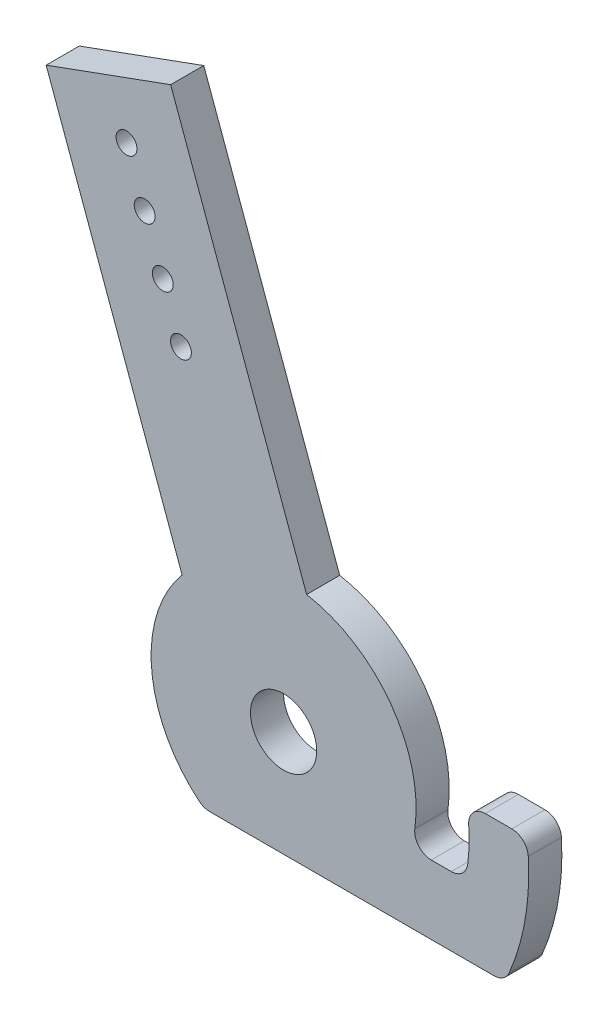
ISO-10303-21;
HEADER;
FILE_DESCRIPTION(('STEP AP214'),'2;1');
FILE_NAME('part.step','',(''),(''),'','','');
FILE_SCHEMA(('AUTOMOTIVE_DESIGN { 1 0 10303 214 1 1 1 1 }'));
ENDSEC;
DATA;
#1=APPLICATION_CONTEXT('core data for automotive mechanical design processes');
#2=APPLICATION_PROTOCOL_DEFINITION('international standard','automotive_design',2000,#1);
#3=PRODUCT_CONTEXT('',#1,'mechanical');
#4=PRODUCT('Part','Part','',(#3));
#5=PRODUCT_RELATED_PRODUCT_CATEGORY('part','',(#4));
#6=PRODUCT_DEFINITION_FORMATION('','',#4);
#7=PRODUCT_DEFINITION_CONTEXT('part definition',#1,'design');
#8=PRODUCT_DEFINITION('design','',#6,#7);
#9=PRODUCT_DEFINITION_SHAPE('','',#8);
#10=(LENGTH_UNIT() NAMED_UNIT(*) SI_UNIT(.MILLI.,.METRE.));
#11=(NAMED_UNIT(*) PLANE_ANGLE_UNIT() SI_UNIT($,.RADIAN.));
#12=(NAMED_UNIT(*) SI_UNIT($,.STERADIAN.) SOLID_ANGLE_UNIT());
#13=UNCERTAINTY_MEASURE_WITH_UNIT(LENGTH_MEASURE(1.E-05),#10,'distance_accuracy_value','');
#14=(GEOMETRIC_REPRESENTATION_CONTEXT(3) GLOBAL_UNCERTAINTY_ASSIGNED_CONTEXT((#13)) GLOBAL_UNIT_ASSIGNED_CONTEXT((#10,
#11,#12)) REPRESENTATION_CONTEXT('',''));
#15=CARTESIAN_POINT('',(0.,0.,0.));
#16=DIRECTION('',(0.,0.,1.));
#17=DIRECTION('',(1.,0.,0.));
#18=AXIS2_PLACEMENT_3D('',#15,#16,#17);
#19=CARTESIAN_POINT('',(0.,0.,1.5875));
#20=DIRECTION('',(0.,0.,1.));
#21=DIRECTION('',(1.,0.,0.));
#22=AXIS2_PLACEMENT_3D('',#19,#20,#21);
#23=PLANE('',#22);
#24=CARTESIAN_POINT('',(-5.79014838102271,15.9083019321514,1.5875));
#25=DIRECTION('',(0.,0.,1.));
#26=DIRECTION('',(1.,0.,0.));
#27=AXIS2_PLACEMENT_3D('',#24,#25,#26);
#28=CIRCLE('',#27,0.500000000000001);
#29=CARTESIAN_POINT('',(-5.29014838102271,15.9083019321514,1.5875));
#30=VERTEX_POINT('',#29);
#31=EDGE_CURVE('E404',#30,#30,#28,.T.);
#32=ORIENTED_EDGE('',*,*,#31,.F.);
#33=EDGE_LOOP('',(#32));
#34=FACE_BOUND('',#33,.T.);
#35=CARTESIAN_POINT('',(-7.52761070911713,20.6819404457438,1.5875));
#36=DIRECTION('',(0.,0.,1.));
#37=DIRECTION('',(1.,0.,0.));
#38=AXIS2_PLACEMENT_3D('',#35,#36,#37);
#39=CIRCLE('',#38,0.500000000000001);
#40=CARTESIAN_POINT('',(-7.02761070911713,20.6819404457438,1.5875));
#41=VERTEX_POINT('',#40);
#42=EDGE_CURVE('E420',#41,#41,#39,.T.);
#43=ORIENTED_EDGE('',*,*,#42,.F.);
#44=EDGE_LOOP('',(#43));
#45=FACE_BOUND('',#44,.T.);
#46=CARTESIAN_POINT('',(0.,0.,1.5875));
#47=DIRECTION('',(0.,0.,1.));
#48=DIRECTION('',(1.,0.,0.));
#49=AXIS2_PLACEMENT_3D('',#46,#47,#48);
#50=CIRCLE('',#49,6.35);
#51=CARTESIAN_POINT('',(6.28944110649737,-0.874888888888844,1.5875));
#52=VERTEX_POINT('',#51);
#53=CARTESIAN_POINT('',(1.10266592818498,6.25352923162753,1.5875));
#54=VERTEX_POINT('',#53);
#55=EDGE_CURVE('E239',#52,#54,#50,.T.);
#56=ORIENTED_EDGE('',*,*,#55,.T.);
#57=DIRECTION('',(-0.342020143325673,0.939692620785907,0.));
#58=VECTOR('',#57,1.);
#59=CARTESIAN_POINT('',(1.10266592818498,6.25352923162753,1.5875));
#60=LINE('',#59,#58);
#61=CARTESIAN_POINT('',(-5.41281780216909,24.1546736575991,1.5875));
#62=VERTEX_POINT('',#61);
#63=EDGE_CURVE('E127',#54,#62,#60,.T.);
#64=ORIENTED_EDGE('',*,*,#63,.T.);
#65=DIRECTION('',(-0.939692620785907,-0.342020143325673,0.));
#66=VECTOR('',#65,1.);
#67=CARTESIAN_POINT('',(-11.3798659441596,21.982845747481,1.5875));
#68=LINE('',#67,#66);
#69=CARTESIAN_POINT('',(-11.3798659441596,21.982845747481,1.5875));
#70=VERTEX_POINT('',#69);
#71=EDGE_CURVE('E292',#62,#70,#68,.T.);
#72=ORIENTED_EDGE('',*,*,#71,.T.);
#73=DIRECTION('',(0.342020143325673,-0.939692620785907,0.));
#74=VECTOR('',#73,1.);
#75=CARTESIAN_POINT('',(-4.86438221380553,4.0817013215095,1.5875));
#76=LINE('',#75,#74);
#77=CARTESIAN_POINT('',(-4.86438221380553,4.0817013215095,1.5875));
#78=VERTEX_POINT('',#77);
#79=EDGE_CURVE('E312',#70,#78,#76,.T.);
#80=ORIENTED_EDGE('',*,*,#79,.T.);
#81=CARTESIAN_POINT('',(0.,0.,1.5875));
#82=DIRECTION('',(0.,0.,1.));
#83=DIRECTION('',(1.,0.,0.));
#84=AXIS2_PLACEMENT_3D('',#81,#82,#83);
#85=CIRCLE('',#84,6.35);
#86=CARTESIAN_POINT('',(-4.04060613759661,-4.89857142857146,1.5875));
#87=VERTEX_POINT('',#86);
#88=EDGE_CURVE('E308',#78,#87,#85,.T.);
#89=ORIENTED_EDGE('',*,*,#88,.T.);
#90=CARTESIAN_POINT('',(-3.53553037039703,-4.28625000000003,1.5875));
#91=DIRECTION('',(0.,0.,1.));
#92=DIRECTION('',(-1.,0.,0.));
#93=AXIS2_PLACEMENT_3D('',#90,#91,#92);
#94=CIRCLE('',#93,0.793749999999999);
#95=CARTESIAN_POINT('',(-3.53553037039703,-5.08000000000003,1.5875));
#96=VERTEX_POINT('',#95);
#97=EDGE_CURVE('E311',#87,#96,#94,.T.);
#98=ORIENTED_EDGE('',*,*,#97,.T.);
#99=DIRECTION('',(1.,0.,0.));
#100=VECTOR('',#99,1.);
#101=CARTESIAN_POINT('',(10.0803124951561,-5.07999999999993,1.5875));
#102=LINE('',#101,#100);
#103=CARTESIAN_POINT('',(10.0803124951561,-5.07999999999993,1.5875));
#104=VERTEX_POINT('',#103);
#105=EDGE_CURVE('E316',#96,#104,#102,.T.);
#106=ORIENTED_EDGE('',*,*,#105,.T.);
#107=CARTESIAN_POINT('',(10.0803124951561,-4.28624999999993,1.5875));
#108=DIRECTION('',(0.,0.,1.));
#109=DIRECTION('',(1.,0.,0.));
#110=AXIS2_PLACEMENT_3D('',#107,#108,#109);
#111=CIRCLE('',#110,0.793749999999999);
#112=CARTESIAN_POINT('',(10.8107699223413,-4.59684782608688,1.5875));
#113=VERTEX_POINT('',#112);
#114=EDGE_CURVE('E323',#104,#113,#111,.T.);
#115=ORIENTED_EDGE('',*,*,#114,.T.);
#116=CARTESIAN_POINT('',(0.,0.,1.5875));
#117=DIRECTION('',(0.,0.,1.));
#118=DIRECTION('',(1.,0.,0.));
#119=AXIS2_PLACEMENT_3D('',#116,#117,#118);
#120=CIRCLE('',#119,11.7475);
#121=CARTESIAN_POINT('',(11.7268086884223,0.696932016156442,1.5875));
#122=VERTEX_POINT('',#121);
#123=EDGE_CURVE('E326',#113,#122,#120,.T.);
#124=ORIENTED_EDGE('',*,*,#123,.T.);
#125=CARTESIAN_POINT('',(10.9344567500154,0.649842015064791,1.5875));
#126=DIRECTION('',(0.,0.,1.));
#127=DIRECTION('',(1.,0.,0.));
#128=AXIS2_PLACEMENT_3D('',#125,#126,#127);
#129=CIRCLE('',#128,0.79375);
#130=CARTESIAN_POINT('',(10.9344567500154,1.44359201506479,1.5875));
#131=VERTEX_POINT('',#130);
#132=EDGE_CURVE('E329',#122,#131,#129,.T.);
#133=ORIENTED_EDGE('',*,*,#132,.T.);
#134=DIRECTION('',(-1.,0.,0.));
#135=VECTOR('',#134,1.);
#136=CARTESIAN_POINT('',(9.66192110389836,1.44359201506479,1.5875));
#137=LINE('',#136,#135);
#138=CARTESIAN_POINT('',(9.66192110389836,1.44359201506479,1.5875));
#139=VERTEX_POINT('',#138);
#140=EDGE_CURVE('E332',#131,#139,#137,.T.);
#141=ORIENTED_EDGE('',*,*,#140,.T.);
#142=CARTESIAN_POINT('',(9.66192110389836,0.649842015064791,1.5875));
#143=DIRECTION('',(0.,0.,1.));
#144=DIRECTION('',(1.,0.,0.));
#145=AXIS2_PLACEMENT_3D('',#142,#143,#144);
#146=CIRCLE('',#145,0.79375);
#147=CARTESIAN_POINT('',(8.86996035767718,0.59657627612505,1.5875));
#148=VERTEX_POINT('',#147);
#149=EDGE_CURVE('E335',#139,#148,#146,.T.);
#150=ORIENTED_EDGE('',*,*,#149,.T.);
#151=CARTESIAN_POINT('',(0.,0.,1.5875));
#152=DIRECTION('',(0.,0.,-1.));
#153=DIRECTION('',(1.,0.,0.));
#154=AXIS2_PLACEMENT_3D('',#151,#152,#153);
#155=CIRCLE('',#154,8.89);
#156=CARTESIAN_POINT('',(8.82406312494784,-1.08074509803915,1.5875));
#157=VERTEX_POINT('',#156);
#158=EDGE_CURVE('E170',#148,#157,#155,.T.);
#159=ORIENTED_EDGE('',*,*,#158,.T.);
#160=CARTESIAN_POINT('',(8.03620034593465,-0.984249999999942,1.5875));
#161=DIRECTION('',(0.,0.,-1.));
#162=DIRECTION('',(1.,0.,0.));
#163=AXIS2_PLACEMENT_3D('',#160,#161,#162);
#164=CIRCLE('',#163,0.793749999999999);
#165=CARTESIAN_POINT('',(8.03620034593465,-1.77799999999994,1.5875));
#166=VERTEX_POINT('',#165);
#167=EDGE_CURVE('E164',#157,#166,#164,.T.);
#168=ORIENTED_EDGE('',*,*,#167,.T.);
#169=DIRECTION('',(-1.,0.,0.));
#170=VECTOR('',#169,1.);
#171=CARTESIAN_POINT('',(8.03620034593465,-1.77799999999994,1.5875));
#172=LINE('',#171,#170);
#173=CARTESIAN_POINT('',(7.07562124480954,-1.77799999999995,1.5875));
#174=VERTEX_POINT('',#173);
#175=EDGE_CURVE('E168',#166,#174,#172,.T.);
#176=ORIENTED_EDGE('',*,*,#175,.T.);
#177=CARTESIAN_POINT('',(7.07562124480954,-0.984249999999949,1.5875));
#178=DIRECTION('',(0.,0.,-1.));
#179=DIRECTION('',(1.,0.,0.));
#180=AXIS2_PLACEMENT_3D('',#177,#178,#179);
#181=CIRCLE('',#180,0.79375);
#182=EDGE_CURVE('E60',#174,#52,#181,.T.);
#183=ORIENTED_EDGE('',*,*,#182,.T.);
#184=EDGE_LOOP('',(#56,#64,#72,#80,#89,#98,#106,#115,#124,#133,#141,#150,#159,#168,#176,#183));
#185=FACE_BOUND('',#184,.T.);
#186=CARTESIAN_POINT('',(0.,0.,1.5875));
#187=DIRECTION('',(0.,0.,1.));
#188=DIRECTION('',(1.,0.,0.));
#189=AXIS2_PLACEMENT_3D('',#186,#187,#188);
#190=CIRCLE('',#189,1.5875);
#191=CARTESIAN_POINT('',(1.5875,0.,1.5875));
#192=VERTEX_POINT('',#191);
#193=EDGE_CURVE('E197',#192,#192,#190,.T.);
#194=ORIENTED_EDGE('',*,*,#193,.F.);
#195=EDGE_LOOP('',(#194));
#196=FACE_BOUND('',#195,.T.);
#197=CARTESIAN_POINT('',(-6.65887954506992,18.2951211889476,1.5875));
#198=DIRECTION('',(0.,0.,1.));
#199=DIRECTION('',(1.,0.,0.));
#200=AXIS2_PLACEMENT_3D('',#197,#198,#199);
#201=CIRCLE('',#200,0.5);
#202=CARTESIAN_POINT('',(-6.15887954506992,18.2951211889476,1.5875));
#203=VERTEX_POINT('',#202);
#204=EDGE_CURVE('E412',#203,#203,#201,.T.);
#205=ORIENTED_EDGE('',*,*,#204,.F.);
#206=EDGE_LOOP('',(#205));
#207=FACE_BOUND('',#206,.T.);
#208=CARTESIAN_POINT('',(-4.9214172169755,13.5214826753552,1.5875));
#209=DIRECTION('',(0.,0.,1.));
#210=DIRECTION('',(1.,0.,0.));
#211=AXIS2_PLACEMENT_3D('',#208,#209,#210);
#212=CIRCLE('',#211,0.500000000000001);
#213=CARTESIAN_POINT('',(-4.4214172169755,13.5214826753552,1.5875));
#214=VERTEX_POINT('',#213);
#215=EDGE_CURVE('E393',#214,#214,#212,.T.);
#216=ORIENTED_EDGE('',*,*,#215,.F.);
#217=EDGE_LOOP('',(#216));
#218=FACE_BOUND('',#217,.T.);
#219=ADVANCED_FACE('F42',(#34,#45,#185,#196,#207,#218),#23,.T.);
#220=CARTESIAN_POINT('',(0.,0.,0.));
#221=DIRECTION('',(0.,0.,1.));
#222=DIRECTION('',(1.,0.,0.));
#223=AXIS2_PLACEMENT_3D('',#220,#221,#222);
#224=PLANE('',#223);
#225=CARTESIAN_POINT('',(-5.79014838102271,15.9083019321514,0.));
#226=DIRECTION('',(0.,0.,1.));
#227=DIRECTION('',(1.,0.,0.));
#228=AXIS2_PLACEMENT_3D('',#225,#226,#227);
#229=CIRCLE('',#228,0.500000000000001);
#230=CARTESIAN_POINT('',(-5.29014838102271,15.9083019321514,0.));
#231=VERTEX_POINT('',#230);
#232=EDGE_CURVE('E401',#231,#231,#229,.T.);
#233=ORIENTED_EDGE('',*,*,#232,.T.);
#234=EDGE_LOOP('',(#233));
#235=FACE_BOUND('',#234,.T.);
#236=CARTESIAN_POINT('',(-7.52761070911713,20.6819404457438,0.));
#237=DIRECTION('',(0.,0.,1.));
#238=DIRECTION('',(1.,0.,0.));
#239=AXIS2_PLACEMENT_3D('',#236,#237,#238);
#240=CIRCLE('',#239,0.500000000000001);
#241=CARTESIAN_POINT('',(-7.02761070911713,20.6819404457438,0.));
#242=VERTEX_POINT('',#241);
#243=EDGE_CURVE('E416',#242,#242,#240,.T.);
#244=ORIENTED_EDGE('',*,*,#243,.T.);
#245=EDGE_LOOP('',(#244));
#246=FACE_BOUND('',#245,.T.);
#247=CARTESIAN_POINT('',(0.,0.,0.));
#248=DIRECTION('',(0.,0.,1.));
#249=DIRECTION('',(1.,0.,0.));
#250=AXIS2_PLACEMENT_3D('',#247,#248,#249);
#251=CIRCLE('',#250,6.35);
#252=CARTESIAN_POINT('',(6.28944110649737,-0.874888888888844,0.));
#253=VERTEX_POINT('',#252);
#254=CARTESIAN_POINT('',(1.10266592818498,6.25352923162753,0.));
#255=VERTEX_POINT('',#254);
#256=EDGE_CURVE('E192',#253,#255,#251,.T.);
#257=ORIENTED_EDGE('',*,*,#256,.F.);
#258=CARTESIAN_POINT('',(7.07562124480954,-0.984249999999949,0.));
#259=DIRECTION('',(0.,0.,-1.));
#260=DIRECTION('',(1.,0.,0.));
#261=AXIS2_PLACEMENT_3D('',#258,#259,#260);
#262=CIRCLE('',#261,0.79375);
#263=CARTESIAN_POINT('',(7.07562124480954,-1.77799999999995,0.));
#264=VERTEX_POINT('',#263);
#265=EDGE_CURVE('E119',#264,#253,#262,.T.);
#266=ORIENTED_EDGE('',*,*,#265,.F.);
#267=DIRECTION('',(-1.,0.,0.));
#268=VECTOR('',#267,1.);
#269=CARTESIAN_POINT('',(8.03620034593465,-1.77799999999994,0.));
#270=LINE('',#269,#268);
#271=CARTESIAN_POINT('',(8.03620034593465,-1.77799999999994,0.));
#272=VERTEX_POINT('',#271);
#273=EDGE_CURVE('E113',#272,#264,#270,.T.);
#274=ORIENTED_EDGE('',*,*,#273,.F.);
#275=CARTESIAN_POINT('',(8.03620034593465,-0.984249999999942,0.));
#276=DIRECTION('',(0.,0.,-1.));
#277=DIRECTION('',(1.,0.,0.));
#278=AXIS2_PLACEMENT_3D('',#275,#276,#277);
#279=CIRCLE('',#278,0.793749999999999);
#280=CARTESIAN_POINT('',(8.82406312494784,-1.08074509803915,0.));
#281=VERTEX_POINT('',#280);
#282=EDGE_CURVE('E179',#281,#272,#279,.T.);
#283=ORIENTED_EDGE('',*,*,#282,.F.);
#284=CARTESIAN_POINT('',(0.,0.,0.));
#285=DIRECTION('',(0.,0.,-1.));
#286=DIRECTION('',(1.,0.,0.));
#287=AXIS2_PLACEMENT_3D('',#284,#285,#286);
#288=CIRCLE('',#287,8.89);
#289=CARTESIAN_POINT('',(8.86996035767718,0.59657627612505,0.));
#290=VERTEX_POINT('',#289);
#291=EDGE_CURVE('E230',#290,#281,#288,.T.);
#292=ORIENTED_EDGE('',*,*,#291,.F.);
#293=CARTESIAN_POINT('',(9.66192110389836,0.649842015064791,0.));
#294=DIRECTION('',(0.,0.,1.));
#295=DIRECTION('',(1.,0.,0.));
#296=AXIS2_PLACEMENT_3D('',#293,#294,#295);
#297=CIRCLE('',#296,0.79375);
#298=CARTESIAN_POINT('',(9.66192110389836,1.44359201506479,0.));
#299=VERTEX_POINT('',#298);
#300=EDGE_CURVE('E227',#299,#290,#297,.T.);
#301=ORIENTED_EDGE('',*,*,#300,.F.);
#302=DIRECTION('',(-1.,0.,0.));
#303=VECTOR('',#302,1.);
#304=CARTESIAN_POINT('',(9.66192110389836,1.44359201506479,0.));
#305=LINE('',#304,#303);
#306=CARTESIAN_POINT('',(10.9344567500154,1.44359201506479,0.));
#307=VERTEX_POINT('',#306);
#308=EDGE_CURVE('E224',#307,#299,#305,.T.);
#309=ORIENTED_EDGE('',*,*,#308,.F.);
#310=CARTESIAN_POINT('',(10.9344567500154,0.649842015064791,0.));
#311=DIRECTION('',(0.,0.,1.));
#312=DIRECTION('',(1.,0.,0.));
#313=AXIS2_PLACEMENT_3D('',#310,#311,#312);
#314=CIRCLE('',#313,0.79375);
#315=CARTESIAN_POINT('',(11.7268086884223,0.696932016156442,0.));
#316=VERTEX_POINT('',#315);
#317=EDGE_CURVE('E221',#316,#307,#314,.T.);
#318=ORIENTED_EDGE('',*,*,#317,.F.);
#319=CARTESIAN_POINT('',(0.,0.,0.));
#320=DIRECTION('',(0.,0.,1.));
#321=DIRECTION('',(1.,0.,0.));
#322=AXIS2_PLACEMENT_3D('',#319,#320,#321);
#323=CIRCLE('',#322,11.7475);
#324=CARTESIAN_POINT('',(10.8107699223413,-4.59684782608688,0.));
#325=VERTEX_POINT('',#324);
#326=EDGE_CURVE('E218',#325,#316,#323,.T.);
#327=ORIENTED_EDGE('',*,*,#326,.F.);
#328=CARTESIAN_POINT('',(10.0803124951561,-4.28624999999993,0.));
#329=DIRECTION('',(0.,0.,1.));
#330=DIRECTION('',(1.,0.,0.));
#331=AXIS2_PLACEMENT_3D('',#328,#329,#330);
#332=CIRCLE('',#331,0.793749999999999);
#333=CARTESIAN_POINT('',(10.0803124951561,-5.07999999999993,0.));
#334=VERTEX_POINT('',#333);
#335=EDGE_CURVE('E215',#334,#325,#332,.T.);
#336=ORIENTED_EDGE('',*,*,#335,.F.);
#337=DIRECTION('',(1.,0.,0.));
#338=VECTOR('',#337,1.);
#339=CARTESIAN_POINT('',(10.0803124951561,-5.07999999999993,0.));
#340=LINE('',#339,#338);
#341=CARTESIAN_POINT('',(-3.53553037039703,-5.08000000000003,0.));
#342=VERTEX_POINT('',#341);
#343=EDGE_CURVE('E212',#342,#334,#340,.T.);
#344=ORIENTED_EDGE('',*,*,#343,.F.);
#345=CARTESIAN_POINT('',(-3.53553037039703,-4.28625000000003,0.));
#346=DIRECTION('',(0.,0.,1.));
#347=DIRECTION('',(-1.,0.,0.));
#348=AXIS2_PLACEMENT_3D('',#345,#346,#347);
#349=CIRCLE('',#348,0.793749999999999);
#350=CARTESIAN_POINT('',(-4.04060613759661,-4.89857142857146,0.));
#351=VERTEX_POINT('',#350);
#352=EDGE_CURVE('E209',#351,#342,#349,.T.);
#353=ORIENTED_EDGE('',*,*,#352,.F.);
#354=CARTESIAN_POINT('',(0.,0.,0.));
#355=DIRECTION('',(0.,0.,1.));
#356=DIRECTION('',(1.,0.,0.));
#357=AXIS2_PLACEMENT_3D('',#354,#355,#356);
#358=CIRCLE('',#357,6.35);
#359=CARTESIAN_POINT('',(-4.86438221380553,4.0817013215095,0.));
#360=VERTEX_POINT('',#359);
#361=EDGE_CURVE('E206',#360,#351,#358,.T.);
#362=ORIENTED_EDGE('',*,*,#361,.F.);
#363=DIRECTION('',(0.342020143325673,-0.939692620785907,0.));
#364=VECTOR('',#363,1.);
#365=CARTESIAN_POINT('',(-4.86438221380553,4.0817013215095,0.));
#366=LINE('',#365,#364);
#367=CARTESIAN_POINT('',(-11.3798659441596,21.982845747481,0.));
#368=VERTEX_POINT('',#367);
#369=EDGE_CURVE('E203',#368,#360,#366,.T.);
#370=ORIENTED_EDGE('',*,*,#369,.F.);
#371=DIRECTION('',(-0.939692620785907,-0.342020143325673,0.));
#372=VECTOR('',#371,1.);
#373=CARTESIAN_POINT('',(-11.3798659441596,21.982845747481,0.));
#374=LINE('',#373,#372);
#375=CARTESIAN_POINT('',(-5.41281780216909,24.1546736575991,0.));
#376=VERTEX_POINT('',#375);
#377=EDGE_CURVE('E200',#376,#368,#374,.T.);
#378=ORIENTED_EDGE('',*,*,#377,.F.);
#379=DIRECTION('',(-0.342020143325673,0.939692620785907,0.));
#380=VECTOR('',#379,1.);
#381=CARTESIAN_POINT('',(1.10266592818498,6.25352923162753,0.));
#382=LINE('',#381,#380);
#383=EDGE_CURVE('E196',#255,#376,#382,.T.);
#384=ORIENTED_EDGE('',*,*,#383,.F.);
#385=EDGE_LOOP('',(#257,#266,#274,#283,#292,#301,#309,#318,#327,#336,#344,#353,#362,#370,#378,#384));
#386=FACE_BOUND('',#385,.T.);
#387=CARTESIAN_POINT('',(0.,0.,0.));
#388=DIRECTION('',(0.,0.,1.));
#389=DIRECTION('',(1.,0.,0.));
#390=AXIS2_PLACEMENT_3D('',#387,#388,#389);
#391=CIRCLE('',#390,1.5875);
#392=CARTESIAN_POINT('',(1.5875,0.,0.));
#393=VERTEX_POINT('',#392);
#394=EDGE_CURVE('E424',#393,#393,#391,.T.);
#395=ORIENTED_EDGE('',*,*,#394,.T.);
#396=EDGE_LOOP('',(#395));
#397=FACE_BOUND('',#396,.T.);
#398=CARTESIAN_POINT('',(-6.65887954506992,18.2951211889476,0.));
#399=DIRECTION('',(0.,0.,1.));
#400=DIRECTION('',(1.,0.,0.));
#401=AXIS2_PLACEMENT_3D('',#398,#399,#400);
#402=CIRCLE('',#401,0.5);
#403=CARTESIAN_POINT('',(-6.15887954506992,18.2951211889476,0.));
#404=VERTEX_POINT('',#403);
#405=EDGE_CURVE('E408',#404,#404,#402,.T.);
#406=ORIENTED_EDGE('',*,*,#405,.T.);
#407=EDGE_LOOP('',(#406));
#408=FACE_BOUND('',#407,.T.);
#409=CARTESIAN_POINT('',(-4.9214172169755,13.5214826753552,0.));
#410=DIRECTION('',(0.,0.,1.));
#411=DIRECTION('',(1.,0.,0.));
#412=AXIS2_PLACEMENT_3D('',#409,#410,#411);
#413=CIRCLE('',#412,0.500000000000001);
#414=CARTESIAN_POINT('',(-4.4214172169755,13.5214826753552,0.));
#415=VERTEX_POINT('',#414);
#416=EDGE_CURVE('E396',#415,#415,#413,.T.);
#417=ORIENTED_EDGE('',*,*,#416,.T.);
#418=EDGE_LOOP('',(#417));
#419=FACE_BOUND('',#418,.T.);
#420=ADVANCED_FACE('F296',(#235,#246,#386,#397,#408,#419),#224,.F.);
#421=CARTESIAN_POINT('',(0.,0.,1.5875));
#422=DIRECTION('',(0.,0.,-1.));
#423=DIRECTION('',(-1.,0.,0.));
#424=AXIS2_PLACEMENT_3D('',#421,#422,#423);
#425=CYLINDRICAL_SURFACE('',#424,6.35);
#426=ORIENTED_EDGE('',*,*,#256,.T.);
#427=DIRECTION('',(0.,0.,-1.));
#428=VECTOR('',#427,1.);
#429=CARTESIAN_POINT('',(1.10266592818498,6.25352923162753,1.5875));
#430=LINE('',#429,#428);
#431=EDGE_CURVE('E11',#54,#255,#430,.T.);
#432=ORIENTED_EDGE('',*,*,#431,.F.);
#433=ORIENTED_EDGE('',*,*,#55,.F.);
#434=DIRECTION('',(0.,0.,-1.));
#435=VECTOR('',#434,1.);
#436=CARTESIAN_POINT('',(6.28944110649737,-0.874888888888844,1.5875));
#437=LINE('',#436,#435);
#438=EDGE_CURVE('E188',#52,#253,#437,.T.);
#439=ORIENTED_EDGE('',*,*,#438,.T.);
#440=EDGE_LOOP('',(#426,#432,#433,#439));
#441=FACE_BOUND('',#440,.T.);
#442=ADVANCED_FACE('F44',(#441),#425,.T.);
#443=CARTESIAN_POINT('',(1.10266592818498,6.25352923162753,1.5875));
#444=DIRECTION('',(-0.939692620785907,-0.342020143325673,0.));
#445=DIRECTION('',(0.342020143325673,-0.939692620785907,0.));
#446=AXIS2_PLACEMENT_3D('',#443,#444,#445);
#447=PLANE('',#446);
#448=ORIENTED_EDGE('',*,*,#383,.T.);
#449=DIRECTION('',(0.,0.,-1.));
#450=VECTOR('',#449,1.);
#451=CARTESIAN_POINT('',(-5.41281780216909,24.1546736575991,1.5875));
#452=LINE('',#451,#450);
#453=EDGE_CURVE('E52',#62,#376,#452,.T.);
#454=ORIENTED_EDGE('',*,*,#453,.F.);
#455=ORIENTED_EDGE('',*,*,#63,.F.);
#456=ORIENTED_EDGE('',*,*,#431,.T.);
#457=EDGE_LOOP('',(#448,#454,#455,#456));
#458=FACE_BOUND('',#457,.T.);
#459=ADVANCED_FACE('F569',(#458),#447,.F.);
#460=CARTESIAN_POINT('',(-11.3798659441596,21.982845747481,1.5875));
#461=DIRECTION('',(0.342020143325673,-0.939692620785907,0.));
#462=DIRECTION('',(0.939692620785907,0.342020143325673,0.));
#463=AXIS2_PLACEMENT_3D('',#460,#461,#462);
#464=PLANE('',#463);
#465=ORIENTED_EDGE('',*,*,#377,.T.);
#466=DIRECTION('',(0.,0.,-1.));
#467=VECTOR('',#466,1.);
#468=CARTESIAN_POINT('',(-11.3798659441596,21.982845747481,1.5875));
#469=LINE('',#468,#467);
#470=EDGE_CURVE('E282',#70,#368,#469,.T.);
#471=ORIENTED_EDGE('',*,*,#470,.F.);
#472=ORIENTED_EDGE('',*,*,#71,.F.);
#473=ORIENTED_EDGE('',*,*,#453,.T.);
#474=EDGE_LOOP('',(#465,#471,#472,#473));
#475=FACE_BOUND('',#474,.T.);
#476=ADVANCED_FACE('F290',(#475),#464,.F.);
#477=CARTESIAN_POINT('',(-4.86438221380553,4.0817013215095,1.5875));
#478=DIRECTION('',(0.939692620785907,0.342020143325673,0.));
#479=DIRECTION('',(-0.342020143325673,0.939692620785907,0.));
#480=AXIS2_PLACEMENT_3D('',#477,#478,#479);
#481=PLANE('',#480);
#482=ORIENTED_EDGE('',*,*,#369,.T.);
#483=DIRECTION('',(0.,0.,-1.));
#484=VECTOR('',#483,1.);
#485=CARTESIAN_POINT('',(-4.86438221380553,4.0817013215095,1.5875));
#486=LINE('',#485,#484);
#487=EDGE_CURVE('E278',#78,#360,#486,.T.);
#488=ORIENTED_EDGE('',*,*,#487,.F.);
#489=ORIENTED_EDGE('',*,*,#79,.F.);
#490=ORIENTED_EDGE('',*,*,#470,.T.);
#491=EDGE_LOOP('',(#482,#488,#489,#490));
#492=FACE_BOUND('',#491,.T.);
#493=ADVANCED_FACE('F302',(#492),#481,.F.);
#494=CARTESIAN_POINT('',(0.,0.,1.5875));
#495=DIRECTION('',(0.,0.,-1.));
#496=DIRECTION('',(-1.,0.,0.));
#497=AXIS2_PLACEMENT_3D('',#494,#495,#496);
#498=CYLINDRICAL_SURFACE('',#497,6.35);
#499=ORIENTED_EDGE('',*,*,#361,.T.);
#500=DIRECTION('',(0.,0.,-1.));
#501=VECTOR('',#500,1.);
#502=CARTESIAN_POINT('',(-4.04060613759661,-4.89857142857146,1.5875));
#503=LINE('',#502,#501);
#504=EDGE_CURVE('E274',#87,#351,#503,.T.);
#505=ORIENTED_EDGE('',*,*,#504,.F.);
#506=ORIENTED_EDGE('',*,*,#88,.F.);
#507=ORIENTED_EDGE('',*,*,#487,.T.);
#508=EDGE_LOOP('',(#499,#505,#506,#507));
#509=FACE_BOUND('',#508,.T.);
#510=ADVANCED_FACE('F306',(#509),#498,.T.);
#511=CARTESIAN_POINT('',(-3.53553037039703,-4.28625000000003,1.5875));
#512=DIRECTION('',(0.,0.,-1.));
#513=DIRECTION('',(-1.,0.,0.));
#514=AXIS2_PLACEMENT_3D('',#511,#512,#513);
#515=CYLINDRICAL_SURFACE('',#514,0.793749999999999);
#516=ORIENTED_EDGE('',*,*,#352,.T.);
#517=DIRECTION('',(0.,0.,-1.));
#518=VECTOR('',#517,1.);
#519=CARTESIAN_POINT('',(-3.53553037039703,-5.08000000000003,1.5875));
#520=LINE('',#519,#518);
#521=EDGE_CURVE('E270',#96,#342,#520,.T.);
#522=ORIENTED_EDGE('',*,*,#521,.F.);
#523=ORIENTED_EDGE('',*,*,#97,.F.);
#524=ORIENTED_EDGE('',*,*,#504,.T.);
#525=EDGE_LOOP('',(#516,#522,#523,#524));
#526=FACE_BOUND('',#525,.T.);
#527=ADVANCED_FACE('F538',(#526),#515,.T.);
#528=CARTESIAN_POINT('',(10.0803124951561,-5.07999999999993,1.5875));
#529=DIRECTION('',(0.,1.,0.));
#530=DIRECTION('',(-1.,0.,0.));
#531=AXIS2_PLACEMENT_3D('',#528,#529,#530);
#532=PLANE('',#531);
#533=ORIENTED_EDGE('',*,*,#343,.T.);
#534=DIRECTION('',(0.,0.,-1.));
#535=VECTOR('',#534,1.);
#536=CARTESIAN_POINT('',(10.0803124951561,-5.07999999999993,1.5875));
#537=LINE('',#536,#535);
#538=EDGE_CURVE('E266',#104,#334,#537,.T.);
#539=ORIENTED_EDGE('',*,*,#538,.F.);
#540=ORIENTED_EDGE('',*,*,#105,.F.);
#541=ORIENTED_EDGE('',*,*,#521,.T.);
#542=EDGE_LOOP('',(#533,#539,#540,#541));
#543=FACE_BOUND('',#542,.T.);
#544=ADVANCED_FACE('F529',(#543),#532,.F.);
#545=CARTESIAN_POINT('',(10.0803124951561,-4.28624999999993,1.5875));
#546=DIRECTION('',(0.,0.,-1.));
#547=DIRECTION('',(-1.,0.,0.));
#548=AXIS2_PLACEMENT_3D('',#545,#546,#547);
#549=CYLINDRICAL_SURFACE('',#548,0.793749999999999);
#550=ORIENTED_EDGE('',*,*,#335,.T.);
#551=DIRECTION('',(0.,0.,-1.));
#552=VECTOR('',#551,1.);
#553=CARTESIAN_POINT('',(10.8107699223413,-4.59684782608688,1.5875));
#554=LINE('',#553,#552);
#555=EDGE_CURVE('E262',#113,#325,#554,.T.);
#556=ORIENTED_EDGE('',*,*,#555,.F.);
#557=ORIENTED_EDGE('',*,*,#114,.F.);
#558=ORIENTED_EDGE('',*,*,#538,.T.);
#559=EDGE_LOOP('',(#550,#556,#557,#558));
#560=FACE_BOUND('',#559,.T.);
#561=ADVANCED_FACE('F520',(#560),#549,.T.);
#562=CARTESIAN_POINT('',(0.,0.,1.5875));
#563=DIRECTION('',(0.,0.,-1.));
#564=DIRECTION('',(-1.,0.,0.));
#565=AXIS2_PLACEMENT_3D('',#562,#563,#564);
#566=CYLINDRICAL_SURFACE('',#565,11.7475);
#567=ORIENTED_EDGE('',*,*,#326,.T.);
#568=DIRECTION('',(0.,0.,-1.));
#569=VECTOR('',#568,1.);
#570=CARTESIAN_POINT('',(11.7268086884223,0.696932016156442,1.5875));
#571=LINE('',#570,#569);
#572=EDGE_CURVE('E258',#122,#316,#571,.T.);
#573=ORIENTED_EDGE('',*,*,#572,.F.);
#574=ORIENTED_EDGE('',*,*,#123,.F.);
#575=ORIENTED_EDGE('',*,*,#555,.T.);
#576=EDGE_LOOP('',(#567,#573,#574,#575));
#577=FACE_BOUND('',#576,.T.);
#578=ADVANCED_FACE('F511',(#577),#566,.T.);
#579=CARTESIAN_POINT('',(10.9344567500154,0.649842015064791,1.5875));
#580=DIRECTION('',(0.,0.,-1.));
#581=DIRECTION('',(-1.,0.,0.));
#582=AXIS2_PLACEMENT_3D('',#579,#580,#581);
#583=CYLINDRICAL_SURFACE('',#582,0.79375);
#584=ORIENTED_EDGE('',*,*,#317,.T.);
#585=DIRECTION('',(0.,0.,-1.));
#586=VECTOR('',#585,1.);
#587=CARTESIAN_POINT('',(10.9344567500154,1.44359201506479,1.5875));
#588=LINE('',#587,#586);
#589=EDGE_CURVE('E254',#131,#307,#588,.T.);
#590=ORIENTED_EDGE('',*,*,#589,.F.);
#591=ORIENTED_EDGE('',*,*,#132,.F.);
#592=ORIENTED_EDGE('',*,*,#572,.T.);
#593=EDGE_LOOP('',(#584,#590,#591,#592));
#594=FACE_BOUND('',#593,.T.);
#595=ADVANCED_FACE('F502',(#594),#583,.T.);
#596=CARTESIAN_POINT('',(9.66192110389836,1.44359201506479,1.5875));
#597=DIRECTION('',(0.,-1.,0.));
#598=DIRECTION('',(1.,0.,0.));
#599=AXIS2_PLACEMENT_3D('',#596,#597,#598);
#600=PLANE('',#599);
#601=ORIENTED_EDGE('',*,*,#308,.T.);
#602=DIRECTION('',(0.,0.,-1.));
#603=VECTOR('',#602,1.);
#604=CARTESIAN_POINT('',(9.66192110389836,1.44359201506479,1.5875));
#605=LINE('',#604,#603);
#606=EDGE_CURVE('E250',#139,#299,#605,.T.);
#607=ORIENTED_EDGE('',*,*,#606,.F.);
#608=ORIENTED_EDGE('',*,*,#140,.F.);
#609=ORIENTED_EDGE('',*,*,#589,.T.);
#610=EDGE_LOOP('',(#601,#607,#608,#609));
#611=FACE_BOUND('',#610,.T.);
#612=ADVANCED_FACE('F494',(#611),#600,.F.);
#613=CARTESIAN_POINT('',(9.66192110389836,0.649842015064791,1.5875));
#614=DIRECTION('',(0.,0.,-1.));
#615=DIRECTION('',(-1.,0.,0.));
#616=AXIS2_PLACEMENT_3D('',#613,#614,#615);
#617=CYLINDRICAL_SURFACE('',#616,0.79375);
#618=ORIENTED_EDGE('',*,*,#300,.T.);
#619=DIRECTION('',(0.,0.,-1.));
#620=VECTOR('',#619,1.);
#621=CARTESIAN_POINT('',(8.86996035767718,0.59657627612505,1.5875));
#622=LINE('',#621,#620);
#623=EDGE_CURVE('E246',#148,#290,#622,.T.);
#624=ORIENTED_EDGE('',*,*,#623,.F.);
#625=ORIENTED_EDGE('',*,*,#149,.F.);
#626=ORIENTED_EDGE('',*,*,#606,.T.);
#627=EDGE_LOOP('',(#618,#624,#625,#626));
#628=FACE_BOUND('',#627,.T.);
#629=ADVANCED_FACE('F343',(#628),#617,.T.);
#630=CARTESIAN_POINT('',(0.,0.,1.5875));
#631=DIRECTION('',(0.,0.,-1.));
#632=DIRECTION('',(-1.,0.,0.));
#633=AXIS2_PLACEMENT_3D('',#630,#631,#632);
#634=CYLINDRICAL_SURFACE('',#633,8.89);
#635=ORIENTED_EDGE('',*,*,#291,.T.);
#636=DIRECTION('',(0.,0.,-1.));
#637=VECTOR('',#636,1.);
#638=CARTESIAN_POINT('',(8.82406312494784,-1.08074509803915,1.5875));
#639=LINE('',#638,#637);
#640=EDGE_CURVE('E181',#157,#281,#639,.T.);
#641=ORIENTED_EDGE('',*,*,#640,.F.);
#642=ORIENTED_EDGE('',*,*,#158,.F.);
#643=ORIENTED_EDGE('',*,*,#623,.T.);
#644=EDGE_LOOP('',(#635,#641,#642,#643));
#645=FACE_BOUND('',#644,.T.);
#646=ADVANCED_FACE('F347',(#645),#634,.F.);
#647=CARTESIAN_POINT('',(8.03620034593465,-0.984249999999942,1.5875));
#648=DIRECTION('',(0.,0.,-1.));
#649=DIRECTION('',(-1.,0.,0.));
#650=AXIS2_PLACEMENT_3D('',#647,#648,#649);
#651=CYLINDRICAL_SURFACE('',#650,0.793749999999999);
#652=ORIENTED_EDGE('',*,*,#282,.T.);
#653=DIRECTION('',(0.,0.,-1.));
#654=VECTOR('',#653,1.);
#655=CARTESIAN_POINT('',(8.03620034593465,-1.77799999999994,1.5875));
#656=LINE('',#655,#654);
#657=EDGE_CURVE('E176',#166,#272,#656,.T.);
#658=ORIENTED_EDGE('',*,*,#657,.F.);
#659=ORIENTED_EDGE('',*,*,#167,.F.);
#660=ORIENTED_EDGE('',*,*,#640,.T.);
#661=EDGE_LOOP('',(#652,#658,#659,#660));
#662=FACE_BOUND('',#661,.T.);
#663=ADVANCED_FACE('F177',(#662),#651,.F.);
#664=CARTESIAN_POINT('',(8.03620034593465,-1.77799999999994,1.5875));
#665=DIRECTION('',(0.,-1.,0.));
#666=DIRECTION('',(1.,0.,0.));
#667=AXIS2_PLACEMENT_3D('',#664,#665,#666);
#668=PLANE('',#667);
#669=ORIENTED_EDGE('',*,*,#273,.T.);
#670=DIRECTION('',(0.,0.,-1.));
#671=VECTOR('',#670,1.);
#672=CARTESIAN_POINT('',(7.07562124480954,-1.77799999999995,1.5875));
#673=LINE('',#672,#671);
#674=EDGE_CURVE('E182',#174,#264,#673,.T.);
#675=ORIENTED_EDGE('',*,*,#674,.F.);
#676=ORIENTED_EDGE('',*,*,#175,.F.);
#677=ORIENTED_EDGE('',*,*,#657,.T.);
#678=EDGE_LOOP('',(#669,#675,#676,#677));
#679=FACE_BOUND('',#678,.T.);
#680=ADVANCED_FACE('F184',(#679),#668,.F.);
#681=CARTESIAN_POINT('',(7.07562124480954,-0.984249999999949,1.5875));
#682=DIRECTION('',(0.,0.,-1.));
#683=DIRECTION('',(-1.,0.,0.));
#684=AXIS2_PLACEMENT_3D('',#681,#682,#683);
#685=CYLINDRICAL_SURFACE('',#684,0.79375);
#686=ORIENTED_EDGE('',*,*,#265,.T.);
#687=ORIENTED_EDGE('',*,*,#438,.F.);
#688=ORIENTED_EDGE('',*,*,#182,.F.);
#689=ORIENTED_EDGE('',*,*,#674,.T.);
#690=EDGE_LOOP('',(#686,#687,#688,#689));
#691=FACE_BOUND('',#690,.T.);
#692=ADVANCED_FACE('F351',(#691),#685,.F.);
#693=CARTESIAN_POINT('',(0.,0.,1.5875));
#694=DIRECTION('',(0.,0.,-1.));
#695=DIRECTION('',(-1.,0.,0.));
#696=AXIS2_PLACEMENT_3D('',#693,#694,#695);
#697=CYLINDRICAL_SURFACE('',#696,1.5875);
#698=ORIENTED_EDGE('',*,*,#193,.T.);
#699=EDGE_LOOP('',(#698));
#700=FACE_BOUND('',#699,.T.);
#701=ORIENTED_EDGE('',*,*,#394,.F.);
#702=EDGE_LOOP('',(#701));
#703=FACE_BOUND('',#702,.T.);
#704=ADVANCED_FACE('F353',(#700,#703),#697,.F.);
#705=CARTESIAN_POINT('',(-7.52761070911713,20.6819404457438,1.5875));
#706=DIRECTION('',(0.,0.,-1.));
#707=DIRECTION('',(-1.,0.,0.));
#708=AXIS2_PLACEMENT_3D('',#705,#706,#707);
#709=CYLINDRICAL_SURFACE('',#708,0.500000000000001);
#710=ORIENTED_EDGE('',*,*,#42,.T.);
#711=EDGE_LOOP('',(#710));
#712=FACE_BOUND('',#711,.T.);
#713=ORIENTED_EDGE('',*,*,#243,.F.);
#714=EDGE_LOOP('',(#713));
#715=FACE_BOUND('',#714,.T.);
#716=ADVANCED_FACE('F359',(#712,#715),#709,.F.);
#717=CARTESIAN_POINT('',(-6.65887954506992,18.2951211889476,1.5875));
#718=DIRECTION('',(0.,0.,-1.));
#719=DIRECTION('',(-1.,0.,0.));
#720=AXIS2_PLACEMENT_3D('',#717,#718,#719);
#721=CYLINDRICAL_SURFACE('',#720,0.5);
#722=ORIENTED_EDGE('',*,*,#204,.T.);
#723=EDGE_LOOP('',(#722));
#724=FACE_BOUND('',#723,.T.);
#725=ORIENTED_EDGE('',*,*,#405,.F.);
#726=EDGE_LOOP('',(#725));
#727=FACE_BOUND('',#726,.T.);
#728=ADVANCED_FACE('F376',(#724,#727),#721,.F.);
#729=CARTESIAN_POINT('',(-5.79014838102271,15.9083019321514,1.5875));
#730=DIRECTION('',(0.,0.,-1.));
#731=DIRECTION('',(-1.,0.,0.));
#732=AXIS2_PLACEMENT_3D('',#729,#730,#731);
#733=CYLINDRICAL_SURFACE('',#732,0.500000000000001);
#734=ORIENTED_EDGE('',*,*,#31,.T.);
#735=EDGE_LOOP('',(#734));
#736=FACE_BOUND('',#735,.T.);
#737=ORIENTED_EDGE('',*,*,#232,.F.);
#738=EDGE_LOOP('',(#737));
#739=FACE_BOUND('',#738,.T.);
#740=ADVANCED_FACE('F380',(#736,#739),#733,.F.);
#741=CARTESIAN_POINT('',(-4.9214172169755,13.5214826753552,1.5875));
#742=DIRECTION('',(0.,0.,-1.));
#743=DIRECTION('',(-1.,0.,0.));
#744=AXIS2_PLACEMENT_3D('',#741,#742,#743);
#745=CYLINDRICAL_SURFACE('',#744,0.500000000000001);
#746=ORIENTED_EDGE('',*,*,#215,.T.);
#747=EDGE_LOOP('',(#746));
#748=FACE_BOUND('',#747,.T.);
#749=ORIENTED_EDGE('',*,*,#416,.F.);
#750=EDGE_LOOP('',(#749));
#751=FACE_BOUND('',#750,.T.);
#752=ADVANCED_FACE('F384',(#748,#751),#745,.F.);
#753=CLOSED_SHELL('',(#219,#420,#442,#459,#476,#493,#510,#527,#544,#561,#578,#595,#612,#629,
#646,#663,#680,#692,#704,#716,#728,#740,#752));
#754=MANIFOLD_SOLID_BREP('B2',#753);
#755=ADVANCED_BREP_SHAPE_REPRESENTATION('',(#18,#754),#14);
#756=SHAPE_DEFINITION_REPRESENTATION(#9,#755);
ENDSEC;
END-ISO-10303-21;
